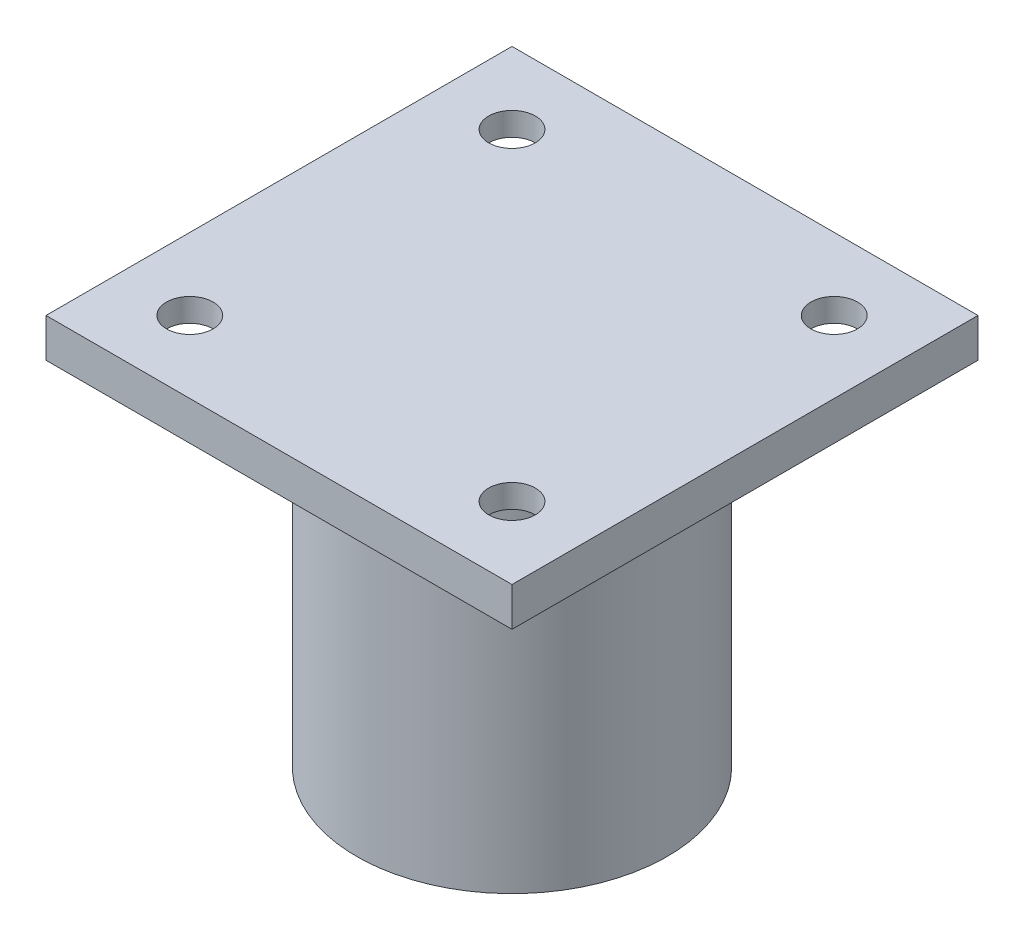
ISO-10303-21;
HEADER;
FILE_DESCRIPTION(('STEP AP214'),'2;1');
FILE_NAME('part.step','',(''),(''),'','','');
FILE_SCHEMA(('AUTOMOTIVE_DESIGN { 1 0 10303 214 1 1 1 1 }'));
ENDSEC;
DATA;
#1=APPLICATION_CONTEXT('core data for automotive mechanical design processes');
#2=APPLICATION_PROTOCOL_DEFINITION('international standard','automotive_design',2000,#1);
#3=PRODUCT_CONTEXT('',#1,'mechanical');
#4=PRODUCT('Part','Part','',(#3));
#5=PRODUCT_RELATED_PRODUCT_CATEGORY('part','',(#4));
#6=PRODUCT_DEFINITION_FORMATION('','',#4);
#7=PRODUCT_DEFINITION_CONTEXT('part definition',#1,'design');
#8=PRODUCT_DEFINITION('design','',#6,#7);
#9=PRODUCT_DEFINITION_SHAPE('','',#8);
#10=(LENGTH_UNIT() NAMED_UNIT(*) SI_UNIT(.MILLI.,.METRE.));
#11=(NAMED_UNIT(*) PLANE_ANGLE_UNIT() SI_UNIT($,.RADIAN.));
#12=(NAMED_UNIT(*) SI_UNIT($,.STERADIAN.) SOLID_ANGLE_UNIT());
#13=UNCERTAINTY_MEASURE_WITH_UNIT(LENGTH_MEASURE(1.E-05),#10,'distance_accuracy_value','');
#14=(GEOMETRIC_REPRESENTATION_CONTEXT(3) GLOBAL_UNCERTAINTY_ASSIGNED_CONTEXT((#13)) GLOBAL_UNIT_ASSIGNED_CONTEXT((#10,
#11,#12)) REPRESENTATION_CONTEXT('',''));
#15=CARTESIAN_POINT('',(0.,0.,0.));
#16=DIRECTION('',(0.,0.,1.));
#17=DIRECTION('',(1.,0.,0.));
#18=AXIS2_PLACEMENT_3D('',#15,#16,#17);
#19=CARTESIAN_POINT('',(15.556349186104,-34.,-15.5563491861041));
#20=DIRECTION('',(0.,1.,0.));
#21=DIRECTION('',(0.,0.,1.));
#22=AXIS2_PLACEMENT_3D('',#19,#20,#21);
#23=CYLINDRICAL_SURFACE('',#22,2.25);
#24=CARTESIAN_POINT('',(15.556349186104,3.75,-15.5563491861041));
#25=DIRECTION('',(0.,1.,0.));
#26=DIRECTION('',(0.,0.,1.));
#27=AXIS2_PLACEMENT_3D('',#24,#25,#26);
#28=CIRCLE('',#27,2.25);
#29=CARTESIAN_POINT('',(15.556349186104,3.75,-13.3063491861041));
#30=VERTEX_POINT('',#29);
#31=EDGE_CURVE('E111',#30,#30,#28,.T.);
#32=ORIENTED_EDGE('',*,*,#31,.T.);
#33=EDGE_LOOP('',(#32));
#34=FACE_BOUND('',#33,.T.);
#35=CARTESIAN_POINT('',(15.556349186104,1.5,-15.5563491861041));
#36=DIRECTION('',(0.,-1.,0.));
#37=DIRECTION('',(0.,0.,-1.));
#38=AXIS2_PLACEMENT_3D('',#35,#36,#37);
#39=CIRCLE('',#38,2.25);
#40=CARTESIAN_POINT('',(15.556349186104,1.5,-17.8063491861041));
#41=VERTEX_POINT('',#40);
#42=EDGE_CURVE('E118',#41,#41,#39,.F.);
#43=ORIENTED_EDGE('',*,*,#42,.F.);
#44=EDGE_LOOP('',(#43));
#45=FACE_BOUND('',#44,.T.);
#46=ADVANCED_FACE('F35',(#34,#45),#23,.F.);
#47=CARTESIAN_POINT('',(-15.556349186104,-34.,15.5563491861041));
#48=DIRECTION('',(0.,1.,0.));
#49=DIRECTION('',(0.,0.,1.));
#50=AXIS2_PLACEMENT_3D('',#47,#48,#49);
#51=CYLINDRICAL_SURFACE('',#50,2.25);
#52=CARTESIAN_POINT('',(-15.556349186104,3.75,15.5563491861041));
#53=DIRECTION('',(0.,1.,0.));
#54=DIRECTION('',(0.,0.,1.));
#55=AXIS2_PLACEMENT_3D('',#52,#53,#54);
#56=CIRCLE('',#55,2.25);
#57=CARTESIAN_POINT('',(-15.556349186104,3.75,17.8063491861041));
#58=VERTEX_POINT('',#57);
#59=EDGE_CURVE('E112',#58,#58,#56,.T.);
#60=ORIENTED_EDGE('',*,*,#59,.T.);
#61=EDGE_LOOP('',(#60));
#62=FACE_BOUND('',#61,.T.);
#63=CARTESIAN_POINT('',(-15.556349186104,1.5,15.5563491861041));
#64=DIRECTION('',(0.,-1.,0.));
#65=DIRECTION('',(0.,0.,-1.));
#66=AXIS2_PLACEMENT_3D('',#63,#64,#65);
#67=CIRCLE('',#66,2.25);
#68=CARTESIAN_POINT('',(-15.556349186104,1.5,13.3063491861041));
#69=VERTEX_POINT('',#68);
#70=EDGE_CURVE('E152',#69,#69,#67,.F.);
#71=ORIENTED_EDGE('',*,*,#70,.F.);
#72=EDGE_LOOP('',(#71));
#73=FACE_BOUND('',#72,.T.);
#74=ADVANCED_FACE('F163',(#62,#73),#51,.F.);
#75=CARTESIAN_POINT('',(22.5,3.75,-22.5));
#76=DIRECTION('',(-1.,0.,0.));
#77=DIRECTION('',(0.,0.,1.));
#78=AXIS2_PLACEMENT_3D('',#75,#76,#77);
#79=PLANE('',#78);
#80=DIRECTION('',(0.,0.,-1.));
#81=VECTOR('',#80,1.);
#82=CARTESIAN_POINT('',(22.5,0.,-22.5));
#83=LINE('',#82,#81);
#84=CARTESIAN_POINT('',(22.5,0.,22.5));
#85=VERTEX_POINT('',#84);
#86=CARTESIAN_POINT('',(22.5,0.,-22.5));
#87=VERTEX_POINT('',#86);
#88=EDGE_CURVE('E124',#85,#87,#83,.T.);
#89=ORIENTED_EDGE('',*,*,#88,.T.);
#90=DIRECTION('',(0.,-1.,0.));
#91=VECTOR('',#90,1.);
#92=CARTESIAN_POINT('',(22.5,3.75,-22.5));
#93=LINE('',#92,#91);
#94=CARTESIAN_POINT('',(22.5,3.75,-22.5));
#95=VERTEX_POINT('',#94);
#96=EDGE_CURVE('E11',#95,#87,#93,.T.);
#97=ORIENTED_EDGE('',*,*,#96,.F.);
#98=DIRECTION('',(0.,0.,-1.));
#99=VECTOR('',#98,1.);
#100=CARTESIAN_POINT('',(22.5,3.75,-22.5));
#101=LINE('',#100,#99);
#102=CARTESIAN_POINT('',(22.5,3.75,22.5));
#103=VERTEX_POINT('',#102);
#104=EDGE_CURVE('E125',#103,#95,#101,.T.);
#105=ORIENTED_EDGE('',*,*,#104,.F.);
#106=DIRECTION('',(0.,-1.,0.));
#107=VECTOR('',#106,1.);
#108=CARTESIAN_POINT('',(22.5,3.75,22.5));
#109=LINE('',#108,#107);
#110=EDGE_CURVE('E135',#103,#85,#109,.T.);
#111=ORIENTED_EDGE('',*,*,#110,.T.);
#112=EDGE_LOOP('',(#89,#97,#105,#111));
#113=FACE_BOUND('',#112,.T.);
#114=ADVANCED_FACE('F37',(#113),#79,.F.);
#115=CARTESIAN_POINT('',(-22.5,3.75,-22.5));
#116=DIRECTION('',(0.,0.,1.));
#117=DIRECTION('',(1.,0.,0.));
#118=AXIS2_PLACEMENT_3D('',#115,#116,#117);
#119=PLANE('',#118);
#120=DIRECTION('',(-1.,0.,0.));
#121=VECTOR('',#120,1.);
#122=CARTESIAN_POINT('',(-22.5,0.,-22.5));
#123=LINE('',#122,#121);
#124=CARTESIAN_POINT('',(-22.5,0.,-22.5));
#125=VERTEX_POINT('',#124);
#126=EDGE_CURVE('E138',#87,#125,#123,.T.);
#127=ORIENTED_EDGE('',*,*,#126,.T.);
#128=DIRECTION('',(0.,-1.,0.));
#129=VECTOR('',#128,1.);
#130=CARTESIAN_POINT('',(-22.5,3.75,-22.5));
#131=LINE('',#130,#129);
#132=CARTESIAN_POINT('',(-22.5,3.75,-22.5));
#133=VERTEX_POINT('',#132);
#134=EDGE_CURVE('E44',#133,#125,#131,.T.);
#135=ORIENTED_EDGE('',*,*,#134,.F.);
#136=DIRECTION('',(-1.,0.,0.));
#137=VECTOR('',#136,1.);
#138=CARTESIAN_POINT('',(-22.5,3.75,-22.5));
#139=LINE('',#138,#137);
#140=EDGE_CURVE('E128',#95,#133,#139,.T.);
#141=ORIENTED_EDGE('',*,*,#140,.F.);
#142=ORIENTED_EDGE('',*,*,#96,.T.);
#143=EDGE_LOOP('',(#127,#135,#141,#142));
#144=FACE_BOUND('',#143,.T.);
#145=ADVANCED_FACE('F196',(#144),#119,.F.);
#146=CARTESIAN_POINT('',(-22.5,3.75,-22.5));
#147=DIRECTION('',(1.,0.,0.));
#148=DIRECTION('',(0.,0.,-1.));
#149=AXIS2_PLACEMENT_3D('',#146,#147,#148);
#150=PLANE('',#149);
#151=DIRECTION('',(0.,0.,1.));
#152=VECTOR('',#151,1.);
#153=CARTESIAN_POINT('',(-22.5,0.,-22.5));
#154=LINE('',#153,#152);
#155=CARTESIAN_POINT('',(-22.5,0.,22.5));
#156=VERTEX_POINT('',#155);
#157=EDGE_CURVE('E140',#125,#156,#154,.T.);
#158=ORIENTED_EDGE('',*,*,#157,.T.);
#159=DIRECTION('',(0.,-1.,0.));
#160=VECTOR('',#159,1.);
#161=CARTESIAN_POINT('',(-22.5,3.75,22.5));
#162=LINE('',#161,#160);
#163=CARTESIAN_POINT('',(-22.5,3.75,22.5));
#164=VERTEX_POINT('',#163);
#165=EDGE_CURVE('E145',#164,#156,#162,.T.);
#166=ORIENTED_EDGE('',*,*,#165,.F.);
#167=DIRECTION('',(0.,0.,1.));
#168=VECTOR('',#167,1.);
#169=CARTESIAN_POINT('',(-22.5,3.75,-22.5));
#170=LINE('',#169,#168);
#171=EDGE_CURVE('E131',#133,#164,#170,.T.);
#172=ORIENTED_EDGE('',*,*,#171,.F.);
#173=ORIENTED_EDGE('',*,*,#134,.T.);
#174=EDGE_LOOP('',(#158,#166,#172,#173));
#175=FACE_BOUND('',#174,.T.);
#176=ADVANCED_FACE('F193',(#175),#150,.F.);
#177=CARTESIAN_POINT('',(-22.5,3.75,22.5));
#178=DIRECTION('',(0.,0.,-1.));
#179=DIRECTION('',(-1.,0.,0.));
#180=AXIS2_PLACEMENT_3D('',#177,#178,#179);
#181=PLANE('',#180);
#182=DIRECTION('',(1.,0.,0.));
#183=VECTOR('',#182,1.);
#184=CARTESIAN_POINT('',(-22.5,0.,22.5));
#185=LINE('',#184,#183);
#186=EDGE_CURVE('E129',#156,#85,#185,.T.);
#187=ORIENTED_EDGE('',*,*,#186,.T.);
#188=ORIENTED_EDGE('',*,*,#110,.F.);
#189=DIRECTION('',(1.,0.,0.));
#190=VECTOR('',#189,1.);
#191=CARTESIAN_POINT('',(-22.5,3.75,22.5));
#192=LINE('',#191,#190);
#193=EDGE_CURVE('E133',#164,#103,#192,.T.);
#194=ORIENTED_EDGE('',*,*,#193,.F.);
#195=ORIENTED_EDGE('',*,*,#165,.T.);
#196=EDGE_LOOP('',(#187,#188,#194,#195));
#197=FACE_BOUND('',#196,.T.);
#198=ADVANCED_FACE('F186',(#197),#181,.F.);
#199=CARTESIAN_POINT('',(0.,3.75,0.));
#200=DIRECTION('',(0.,1.,0.));
#201=DIRECTION('',(0.,0.,1.));
#202=AXIS2_PLACEMENT_3D('',#199,#200,#201);
#203=PLANE('',#202);
#204=CARTESIAN_POINT('',(-15.5563491861041,3.75,-15.556349186104));
#205=DIRECTION('',(0.,1.,0.));
#206=DIRECTION('',(0.,0.,1.));
#207=AXIS2_PLACEMENT_3D('',#204,#205,#206);
#208=CIRCLE('',#207,2.25);
#209=CARTESIAN_POINT('',(-15.5563491861041,3.75,-13.306349186104));
#210=VERTEX_POINT('',#209);
#211=EDGE_CURVE('E115',#210,#210,#208,.T.);
#212=ORIENTED_EDGE('',*,*,#211,.F.);
#213=EDGE_LOOP('',(#212));
#214=FACE_BOUND('',#213,.T.);
#215=ORIENTED_EDGE('',*,*,#59,.F.);
#216=EDGE_LOOP('',(#215));
#217=FACE_BOUND('',#216,.T.);
#218=CARTESIAN_POINT('',(15.5563491861041,3.75,15.556349186104));
#219=DIRECTION('',(0.,1.,0.));
#220=DIRECTION('',(0.,0.,1.));
#221=AXIS2_PLACEMENT_3D('',#218,#219,#220);
#222=CIRCLE('',#221,2.25);
#223=CARTESIAN_POINT('',(15.5563491861041,3.75,17.806349186104));
#224=VERTEX_POINT('',#223);
#225=EDGE_CURVE('E108',#224,#224,#222,.T.);
#226=ORIENTED_EDGE('',*,*,#225,.F.);
#227=EDGE_LOOP('',(#226));
#228=FACE_BOUND('',#227,.T.);
#229=ORIENTED_EDGE('',*,*,#31,.F.);
#230=EDGE_LOOP('',(#229));
#231=FACE_BOUND('',#230,.T.);
#232=ORIENTED_EDGE('',*,*,#104,.T.);
#233=ORIENTED_EDGE('',*,*,#140,.T.);
#234=ORIENTED_EDGE('',*,*,#171,.T.);
#235=ORIENTED_EDGE('',*,*,#193,.T.);
#236=EDGE_LOOP('',(#232,#233,#234,#235));
#237=FACE_BOUND('',#236,.T.);
#238=ADVANCED_FACE('F183',(#214,#217,#228,#231,#237),#203,.T.);
#239=CARTESIAN_POINT('',(0.,0.,0.));
#240=DIRECTION('',(0.,1.,0.));
#241=DIRECTION('',(0.,0.,1.));
#242=AXIS2_PLACEMENT_3D('',#239,#240,#241);
#243=PLANE('',#242);
#244=CARTESIAN_POINT('',(0.,0.,0.));
#245=DIRECTION('',(0.,-1.,0.));
#246=DIRECTION('',(0.,0.,-1.));
#247=AXIS2_PLACEMENT_3D('',#244,#245,#246);
#248=CIRCLE('',#247,17.);
#249=CARTESIAN_POINT('',(-12.0208152801712,0.,12.0208152801714));
#250=VERTEX_POINT('',#249);
#251=CARTESIAN_POINT('',(-12.0208152801712,0.,-12.0208152801714));
#252=VERTEX_POINT('',#251);
#253=EDGE_CURVE('E95',#250,#252,#248,.T.);
#254=ORIENTED_EDGE('',*,*,#253,.F.);
#255=CARTESIAN_POINT('',(-15.556349186104,0.,15.5563491861041));
#256=DIRECTION('',(0.,-1.,0.));
#257=DIRECTION('',(0.,0.,-1.));
#258=AXIS2_PLACEMENT_3D('',#255,#256,#257);
#259=CIRCLE('',#258,5.);
#260=EDGE_CURVE('E91',#250,#250,#259,.T.);
#261=ORIENTED_EDGE('',*,*,#260,.F.);
#262=CARTESIAN_POINT('',(12.0208152801712,0.,12.0208152801714));
#263=VERTEX_POINT('',#262);
#264=EDGE_CURVE('E59',#263,#250,#248,.T.);
#265=ORIENTED_EDGE('',*,*,#264,.F.);
#266=CARTESIAN_POINT('',(15.556349186104,0.,15.5563491861041));
#267=DIRECTION('',(0.,-1.,0.));
#268=DIRECTION('',(0.,0.,1.));
#269=AXIS2_PLACEMENT_3D('',#266,#267,#268);
#270=CIRCLE('',#269,5.);
#271=EDGE_CURVE('E104',#263,#263,#270,.T.);
#272=ORIENTED_EDGE('',*,*,#271,.F.);
#273=CARTESIAN_POINT('',(12.0208152801712,0.,-12.0208152801714));
#274=VERTEX_POINT('',#273);
#275=EDGE_CURVE('E448',#274,#263,#248,.T.);
#276=ORIENTED_EDGE('',*,*,#275,.F.);
#277=CARTESIAN_POINT('',(15.5563491861039,0.,-15.5563491861041));
#278=DIRECTION('',(0.,-1.,0.));
#279=DIRECTION('',(0.,0.,-1.));
#280=AXIS2_PLACEMENT_3D('',#277,#278,#279);
#281=CIRCLE('',#280,5.);
#282=EDGE_CURVE('E482',#274,#274,#281,.T.);
#283=ORIENTED_EDGE('',*,*,#282,.F.);
#284=EDGE_CURVE('E52',#252,#274,#248,.T.);
#285=ORIENTED_EDGE('',*,*,#284,.F.);
#286=CARTESIAN_POINT('',(-15.5563491861039,0.,-15.5563491861041));
#287=DIRECTION('',(0.,-1.,0.));
#288=DIRECTION('',(0.,0.,1.));
#289=AXIS2_PLACEMENT_3D('',#286,#287,#288);
#290=CIRCLE('',#289,5.);
#291=EDGE_CURVE('E457',#252,#252,#290,.T.);
#292=ORIENTED_EDGE('',*,*,#291,.F.);
#293=EDGE_LOOP('',(#254,#261,#265,#272,#276,#283,#285,#292));
#294=FACE_BOUND('',#293,.T.);
#295=ORIENTED_EDGE('',*,*,#88,.F.);
#296=ORIENTED_EDGE('',*,*,#186,.F.);
#297=ORIENTED_EDGE('',*,*,#157,.F.);
#298=ORIENTED_EDGE('',*,*,#126,.F.);
#299=EDGE_LOOP('',(#295,#296,#297,#298));
#300=FACE_BOUND('',#299,.T.);
#301=ADVANCED_FACE('F92',(#294,#300),#243,.F.);
#302=CARTESIAN_POINT('',(15.5563491861041,-34.,15.556349186104));
#303=DIRECTION('',(0.,1.,0.));
#304=DIRECTION('',(0.,0.,1.));
#305=AXIS2_PLACEMENT_3D('',#302,#303,#304);
#306=CYLINDRICAL_SURFACE('',#305,2.25);
#307=CARTESIAN_POINT('',(15.5563491861041,1.5,15.556349186104));
#308=DIRECTION('',(0.,1.,0.));
#309=DIRECTION('',(0.,0.,1.));
#310=AXIS2_PLACEMENT_3D('',#307,#308,#309);
#311=CIRCLE('',#310,2.25);
#312=CARTESIAN_POINT('',(15.5563491861041,1.5,17.806349186104));
#313=VERTEX_POINT('',#312);
#314=EDGE_CURVE('E155',#313,#313,#311,.F.);
#315=ORIENTED_EDGE('',*,*,#314,.T.);
#316=EDGE_LOOP('',(#315));
#317=FACE_BOUND('',#316,.T.);
#318=ORIENTED_EDGE('',*,*,#225,.T.);
#319=EDGE_LOOP('',(#318));
#320=FACE_BOUND('',#319,.T.);
#321=ADVANCED_FACE('F190',(#317,#320),#306,.F.);
#322=CARTESIAN_POINT('',(-15.5563491861041,-34.,-15.556349186104));
#323=DIRECTION('',(0.,1.,0.));
#324=DIRECTION('',(0.,0.,1.));
#325=AXIS2_PLACEMENT_3D('',#322,#323,#324);
#326=CYLINDRICAL_SURFACE('',#325,2.25);
#327=CARTESIAN_POINT('',(-15.5563491861041,1.5,-15.556349186104));
#328=DIRECTION('',(0.,1.,0.));
#329=DIRECTION('',(0.,0.,1.));
#330=AXIS2_PLACEMENT_3D('',#327,#328,#329);
#331=CIRCLE('',#330,2.25);
#332=CARTESIAN_POINT('',(-15.5563491861041,1.5,-13.306349186104));
#333=VERTEX_POINT('',#332);
#334=EDGE_CURVE('E101',#333,#333,#331,.F.);
#335=ORIENTED_EDGE('',*,*,#334,.T.);
#336=EDGE_LOOP('',(#335));
#337=FACE_BOUND('',#336,.T.);
#338=ORIENTED_EDGE('',*,*,#211,.T.);
#339=EDGE_LOOP('',(#338));
#340=FACE_BOUND('',#339,.T.);
#341=ADVANCED_FACE('F173',(#337,#340),#326,.F.);
#342=CARTESIAN_POINT('',(-15.5563491861039,1.5,-15.5563491861041));
#343=DIRECTION('',(0.,1.,0.));
#344=DIRECTION('',(0.,0.,1.));
#345=AXIS2_PLACEMENT_3D('',#342,#343,#344);
#346=PLANE('',#345);
#347=CARTESIAN_POINT('',(-15.5563491861039,1.5,-15.5563491861041));
#348=DIRECTION('',(0.,-1.,0.));
#349=DIRECTION('',(0.,0.,1.));
#350=AXIS2_PLACEMENT_3D('',#347,#348,#349);
#351=CIRCLE('',#350,5.);
#352=CARTESIAN_POINT('',(-15.5563491861039,1.5,-10.5563491861041));
#353=VERTEX_POINT('',#352);
#354=EDGE_CURVE('E485',#353,#353,#351,.T.);
#355=ORIENTED_EDGE('',*,*,#354,.T.);
#356=EDGE_LOOP('',(#355));
#357=FACE_BOUND('',#356,.T.);
#358=ORIENTED_EDGE('',*,*,#334,.F.);
#359=EDGE_LOOP('',(#358));
#360=FACE_BOUND('',#359,.T.);
#361=ADVANCED_FACE('F243',(#357,#360),#346,.F.);
#362=CARTESIAN_POINT('',(-15.5563491861039,1.5,-15.5563491861041));
#363=DIRECTION('',(0.,-1.,0.));
#364=DIRECTION('',(0.,0.,-1.));
#365=AXIS2_PLACEMENT_3D('',#362,#363,#364);
#366=CYLINDRICAL_SURFACE('',#365,5.);
#367=ORIENTED_EDGE('',*,*,#354,.F.);
#368=EDGE_LOOP('',(#367));
#369=FACE_BOUND('',#368,.T.);
#370=ORIENTED_EDGE('',*,*,#291,.T.);
#371=EDGE_LOOP('',(#370));
#372=FACE_BOUND('',#371,.T.);
#373=ADVANCED_FACE('F252',(#369,#372),#366,.F.);
#374=CARTESIAN_POINT('',(-15.556349186104,1.5,15.5563491861041));
#375=DIRECTION('',(0.,-1.,0.));
#376=DIRECTION('',(0.,0.,-1.));
#377=AXIS2_PLACEMENT_3D('',#374,#375,#376);
#378=PLANE('',#377);
#379=CARTESIAN_POINT('',(-15.556349186104,1.5,15.5563491861041));
#380=DIRECTION('',(0.,-1.,0.));
#381=DIRECTION('',(0.,0.,-1.));
#382=AXIS2_PLACEMENT_3D('',#379,#380,#381);
#383=CIRCLE('',#382,5.);
#384=CARTESIAN_POINT('',(-15.556349186104,1.5,10.5563491861041));
#385=VERTEX_POINT('',#384);
#386=EDGE_CURVE('E97',#385,#385,#383,.T.);
#387=ORIENTED_EDGE('',*,*,#386,.T.);
#388=EDGE_LOOP('',(#387));
#389=FACE_BOUND('',#388,.T.);
#390=ORIENTED_EDGE('',*,*,#70,.T.);
#391=EDGE_LOOP('',(#390));
#392=FACE_BOUND('',#391,.T.);
#393=ADVANCED_FACE('F260',(#389,#392),#378,.T.);
#394=CARTESIAN_POINT('',(-15.556349186104,1.5,15.5563491861041));
#395=DIRECTION('',(0.,-1.,0.));
#396=DIRECTION('',(0.,0.,-1.));
#397=AXIS2_PLACEMENT_3D('',#394,#395,#396);
#398=CYLINDRICAL_SURFACE('',#397,5.);
#399=ORIENTED_EDGE('',*,*,#386,.F.);
#400=EDGE_LOOP('',(#399));
#401=FACE_BOUND('',#400,.T.);
#402=ORIENTED_EDGE('',*,*,#260,.T.);
#403=EDGE_LOOP('',(#402));
#404=FACE_BOUND('',#403,.T.);
#405=ADVANCED_FACE('F265',(#401,#404),#398,.F.);
#406=CARTESIAN_POINT('',(15.556349186104,1.5,15.5563491861041));
#407=DIRECTION('',(0.,1.,0.));
#408=DIRECTION('',(0.,0.,1.));
#409=AXIS2_PLACEMENT_3D('',#406,#407,#408);
#410=PLANE('',#409);
#411=CARTESIAN_POINT('',(15.556349186104,1.5,15.5563491861041));
#412=DIRECTION('',(0.,-1.,0.));
#413=DIRECTION('',(0.,0.,1.));
#414=AXIS2_PLACEMENT_3D('',#411,#412,#413);
#415=CIRCLE('',#414,5.);
#416=CARTESIAN_POINT('',(15.556349186104,1.5,20.5563491861041));
#417=VERTEX_POINT('',#416);
#418=EDGE_CURVE('E98',#417,#417,#415,.T.);
#419=ORIENTED_EDGE('',*,*,#418,.T.);
#420=EDGE_LOOP('',(#419));
#421=FACE_BOUND('',#420,.T.);
#422=ORIENTED_EDGE('',*,*,#314,.F.);
#423=EDGE_LOOP('',(#422));
#424=FACE_BOUND('',#423,.T.);
#425=ADVANCED_FACE('F273',(#421,#424),#410,.F.);
#426=CARTESIAN_POINT('',(15.556349186104,1.5,15.5563491861041));
#427=DIRECTION('',(0.,-1.,0.));
#428=DIRECTION('',(0.,0.,-1.));
#429=AXIS2_PLACEMENT_3D('',#426,#427,#428);
#430=CYLINDRICAL_SURFACE('',#429,5.);
#431=ORIENTED_EDGE('',*,*,#418,.F.);
#432=EDGE_LOOP('',(#431));
#433=FACE_BOUND('',#432,.T.);
#434=ORIENTED_EDGE('',*,*,#271,.T.);
#435=EDGE_LOOP('',(#434));
#436=FACE_BOUND('',#435,.T.);
#437=ADVANCED_FACE('F278',(#433,#436),#430,.F.);
#438=CARTESIAN_POINT('',(15.5563491861039,1.5,-15.5563491861041));
#439=DIRECTION('',(0.,-1.,0.));
#440=DIRECTION('',(0.,0.,-1.));
#441=AXIS2_PLACEMENT_3D('',#438,#439,#440);
#442=PLANE('',#441);
#443=CARTESIAN_POINT('',(15.5563491861039,1.5,-15.5563491861041));
#444=DIRECTION('',(0.,-1.,0.));
#445=DIRECTION('',(0.,0.,-1.));
#446=AXIS2_PLACEMENT_3D('',#443,#444,#445);
#447=CIRCLE('',#446,5.);
#448=CARTESIAN_POINT('',(15.5563491861039,1.5,-20.5563491861041));
#449=VERTEX_POINT('',#448);
#450=EDGE_CURVE('E479',#449,#449,#447,.T.);
#451=ORIENTED_EDGE('',*,*,#450,.T.);
#452=EDGE_LOOP('',(#451));
#453=FACE_BOUND('',#452,.T.);
#454=ORIENTED_EDGE('',*,*,#42,.T.);
#455=EDGE_LOOP('',(#454));
#456=FACE_BOUND('',#455,.T.);
#457=ADVANCED_FACE('F160',(#453,#456),#442,.T.);
#458=CARTESIAN_POINT('',(15.5563491861039,1.5,-15.5563491861041));
#459=DIRECTION('',(0.,-1.,0.));
#460=DIRECTION('',(0.,0.,-1.));
#461=AXIS2_PLACEMENT_3D('',#458,#459,#460);
#462=CYLINDRICAL_SURFACE('',#461,5.);
#463=ORIENTED_EDGE('',*,*,#450,.F.);
#464=EDGE_LOOP('',(#463));
#465=FACE_BOUND('',#464,.T.);
#466=ORIENTED_EDGE('',*,*,#282,.T.);
#467=EDGE_LOOP('',(#466));
#468=FACE_BOUND('',#467,.T.);
#469=ADVANCED_FACE('F290',(#465,#468),#462,.F.);
#470=CARTESIAN_POINT('',(0.,-4.,0.));
#471=DIRECTION('',(0.,1.,0.));
#472=DIRECTION('',(0.,0.,1.));
#473=AXIS2_PLACEMENT_3D('',#470,#471,#472);
#474=CYLINDRICAL_SURFACE('',#473,17.);
#475=CARTESIAN_POINT('',(0.,-4.,0.));
#476=DIRECTION('',(0.,-1.,0.));
#477=DIRECTION('',(0.,0.,-1.));
#478=AXIS2_PLACEMENT_3D('',#475,#476,#477);
#479=CIRCLE('',#478,17.);
#480=CARTESIAN_POINT('',(0.,-4.,-17.));
#481=VERTEX_POINT('',#480);
#482=EDGE_CURVE('E447',#481,#481,#479,.T.);
#483=ORIENTED_EDGE('',*,*,#482,.F.);
#484=EDGE_LOOP('',(#483));
#485=FACE_BOUND('',#484,.T.);
#486=ORIENTED_EDGE('',*,*,#275,.T.);
#487=ORIENTED_EDGE('',*,*,#264,.T.);
#488=ORIENTED_EDGE('',*,*,#253,.T.);
#489=ORIENTED_EDGE('',*,*,#284,.T.);
#490=EDGE_LOOP('',(#486,#487,#488,#489));
#491=FACE_BOUND('',#490,.T.);
#492=ADVANCED_FACE('F416',(#485,#491),#474,.T.);
#493=CARTESIAN_POINT('',(0.,-4.,0.));
#494=DIRECTION('',(0.,-1.,0.));
#495=DIRECTION('',(0.,0.,-1.));
#496=AXIS2_PLACEMENT_3D('',#493,#494,#495);
#497=PLANE('',#496);
#498=CARTESIAN_POINT('',(0.,-4.,0.));
#499=DIRECTION('',(0.,-1.,0.));
#500=DIRECTION('',(0.,0.,-1.));
#501=AXIS2_PLACEMENT_3D('',#498,#499,#500);
#502=CIRCLE('',#501,15.);
#503=CARTESIAN_POINT('',(0.,-4.,-15.));
#504=VERTEX_POINT('',#503);
#505=EDGE_CURVE('E39',#504,#504,#502,.T.);
#506=ORIENTED_EDGE('',*,*,#505,.F.);
#507=EDGE_LOOP('',(#506));
#508=FACE_BOUND('',#507,.T.);
#509=ORIENTED_EDGE('',*,*,#482,.T.);
#510=EDGE_LOOP('',(#509));
#511=FACE_BOUND('',#510,.T.);
#512=ADVANCED_FACE('F325',(#508,#511),#497,.T.);
#513=CARTESIAN_POINT('',(0.,-19.,7.5));
#514=DIRECTION('',(0.,-1.,0.));
#515=DIRECTION('',(0.,0.,-1.));
#516=AXIS2_PLACEMENT_3D('',#513,#514,#515);
#517=PLANE('',#516);
#518=CARTESIAN_POINT('',(0.,-19.,7.5));
#519=DIRECTION('',(0.,-1.,0.));
#520=DIRECTION('',(0.,0.,-1.));
#521=AXIS2_PLACEMENT_3D('',#518,#519,#520);
#522=CIRCLE('',#521,1.55);
#523=CARTESIAN_POINT('',(0.,-19.,5.95));
#524=VERTEX_POINT('',#523);
#525=EDGE_CURVE('E473',#524,#524,#522,.T.);
#526=ORIENTED_EDGE('',*,*,#525,.T.);
#527=EDGE_LOOP('',(#526));
#528=FACE_BOUND('',#527,.T.);
#529=ADVANCED_FACE('F320',(#528),#517,.T.);
#530=CARTESIAN_POINT('',(-7.5,-19.,0.));
#531=DIRECTION('',(0.,-1.,0.));
#532=DIRECTION('',(0.,0.,-1.));
#533=AXIS2_PLACEMENT_3D('',#530,#531,#532);
#534=PLANE('',#533);
#535=CARTESIAN_POINT('',(-7.5,-19.,0.));
#536=DIRECTION('',(0.,-1.,0.));
#537=DIRECTION('',(0.,0.,-1.));
#538=AXIS2_PLACEMENT_3D('',#535,#536,#537);
#539=CIRCLE('',#538,1.55);
#540=CARTESIAN_POINT('',(-7.5,-19.,-1.55));
#541=VERTEX_POINT('',#540);
#542=EDGE_CURVE('E467',#541,#541,#539,.T.);
#543=ORIENTED_EDGE('',*,*,#542,.T.);
#544=EDGE_LOOP('',(#543));
#545=FACE_BOUND('',#544,.T.);
#546=ADVANCED_FACE('F324',(#545),#534,.T.);
#547=CARTESIAN_POINT('',(0.,-19.,-7.5));
#548=DIRECTION('',(0.,-1.,0.));
#549=DIRECTION('',(0.,0.,-1.));
#550=AXIS2_PLACEMENT_3D('',#547,#548,#549);
#551=PLANE('',#550);
#552=CARTESIAN_POINT('',(0.,-19.,-7.5));
#553=DIRECTION('',(0.,-1.,0.));
#554=DIRECTION('',(0.,0.,-1.));
#555=AXIS2_PLACEMENT_3D('',#552,#553,#554);
#556=CIRCLE('',#555,1.55);
#557=CARTESIAN_POINT('',(0.,-19.,-9.05));
#558=VERTEX_POINT('',#557);
#559=EDGE_CURVE('E461',#558,#558,#556,.T.);
#560=ORIENTED_EDGE('',*,*,#559,.T.);
#561=EDGE_LOOP('',(#560));
#562=FACE_BOUND('',#561,.T.);
#563=ADVANCED_FACE('F346',(#562),#551,.T.);
#564=CARTESIAN_POINT('',(7.5,-19.,0.));
#565=DIRECTION('',(0.,-1.,0.));
#566=DIRECTION('',(0.,0.,-1.));
#567=AXIS2_PLACEMENT_3D('',#564,#565,#566);
#568=PLANE('',#567);
#569=CARTESIAN_POINT('',(7.5,-19.,0.));
#570=DIRECTION('',(0.,-1.,0.));
#571=DIRECTION('',(0.,0.,-1.));
#572=AXIS2_PLACEMENT_3D('',#569,#570,#571);
#573=CIRCLE('',#572,1.55);
#574=CARTESIAN_POINT('',(7.5,-19.,-1.55));
#575=VERTEX_POINT('',#574);
#576=EDGE_CURVE('E454',#575,#575,#573,.T.);
#577=ORIENTED_EDGE('',*,*,#576,.T.);
#578=EDGE_LOOP('',(#577));
#579=FACE_BOUND('',#578,.T.);
#580=ADVANCED_FACE('F311',(#579),#568,.T.);
#581=CARTESIAN_POINT('',(0.,-19.,7.5));
#582=DIRECTION('',(0.,-1.,0.));
#583=DIRECTION('',(0.,0.,-1.));
#584=AXIS2_PLACEMENT_3D('',#581,#582,#583);
#585=CYLINDRICAL_SURFACE('',#584,1.55);
#586=ORIENTED_EDGE('',*,*,#525,.F.);
#587=EDGE_LOOP('',(#586));
#588=FACE_BOUND('',#587,.T.);
#589=CARTESIAN_POINT('',(0.,-34.,7.5));
#590=DIRECTION('',(0.,-1.,0.));
#591=DIRECTION('',(0.,0.,-1.));
#592=AXIS2_PLACEMENT_3D('',#589,#590,#591);
#593=CIRCLE('',#592,1.55);
#594=CARTESIAN_POINT('',(0.,-34.,5.95));
#595=VERTEX_POINT('',#594);
#596=EDGE_CURVE('E450',#595,#595,#593,.T.);
#597=ORIENTED_EDGE('',*,*,#596,.T.);
#598=EDGE_LOOP('',(#597));
#599=FACE_BOUND('',#598,.T.);
#600=ADVANCED_FACE('F305',(#588,#599),#585,.F.);
#601=CARTESIAN_POINT('',(-7.5,-19.,0.));
#602=DIRECTION('',(0.,-1.,0.));
#603=DIRECTION('',(0.,0.,-1.));
#604=AXIS2_PLACEMENT_3D('',#601,#602,#603);
#605=CYLINDRICAL_SURFACE('',#604,1.55);
#606=ORIENTED_EDGE('',*,*,#542,.F.);
#607=EDGE_LOOP('',(#606));
#608=FACE_BOUND('',#607,.T.);
#609=CARTESIAN_POINT('',(-7.5,-34.,0.));
#610=DIRECTION('',(0.,-1.,0.));
#611=DIRECTION('',(0.,0.,-1.));
#612=AXIS2_PLACEMENT_3D('',#609,#610,#611);
#613=CIRCLE('',#612,1.55);
#614=CARTESIAN_POINT('',(-7.5,-34.,-1.55));
#615=VERTEX_POINT('',#614);
#616=EDGE_CURVE('E470',#615,#615,#613,.T.);
#617=ORIENTED_EDGE('',*,*,#616,.T.);
#618=EDGE_LOOP('',(#617));
#619=FACE_BOUND('',#618,.T.);
#620=ADVANCED_FACE('F310',(#608,#619),#605,.F.);
#621=CARTESIAN_POINT('',(0.,-19.,-7.5));
#622=DIRECTION('',(0.,-1.,0.));
#623=DIRECTION('',(0.,0.,-1.));
#624=AXIS2_PLACEMENT_3D('',#621,#622,#623);
#625=CYLINDRICAL_SURFACE('',#624,1.55);
#626=ORIENTED_EDGE('',*,*,#559,.F.);
#627=EDGE_LOOP('',(#626));
#628=FACE_BOUND('',#627,.T.);
#629=CARTESIAN_POINT('',(0.,-34.,-7.5));
#630=DIRECTION('',(0.,-1.,0.));
#631=DIRECTION('',(0.,0.,-1.));
#632=AXIS2_PLACEMENT_3D('',#629,#630,#631);
#633=CIRCLE('',#632,1.55);
#634=CARTESIAN_POINT('',(0.,-34.,-9.05));
#635=VERTEX_POINT('',#634);
#636=EDGE_CURVE('E464',#635,#635,#633,.T.);
#637=ORIENTED_EDGE('',*,*,#636,.T.);
#638=EDGE_LOOP('',(#637));
#639=FACE_BOUND('',#638,.T.);
#640=ADVANCED_FACE('F336',(#628,#639),#625,.F.);
#641=CARTESIAN_POINT('',(7.5,-19.,0.));
#642=DIRECTION('',(0.,-1.,0.));
#643=DIRECTION('',(0.,0.,-1.));
#644=AXIS2_PLACEMENT_3D('',#641,#642,#643);
#645=CYLINDRICAL_SURFACE('',#644,1.55);
#646=ORIENTED_EDGE('',*,*,#576,.F.);
#647=EDGE_LOOP('',(#646));
#648=FACE_BOUND('',#647,.T.);
#649=CARTESIAN_POINT('',(7.5,-34.,0.));
#650=DIRECTION('',(0.,-1.,0.));
#651=DIRECTION('',(0.,0.,-1.));
#652=AXIS2_PLACEMENT_3D('',#649,#650,#651);
#653=CIRCLE('',#652,1.55);
#654=CARTESIAN_POINT('',(7.5,-34.,-1.55));
#655=VERTEX_POINT('',#654);
#656=EDGE_CURVE('E458',#655,#655,#653,.T.);
#657=ORIENTED_EDGE('',*,*,#656,.T.);
#658=EDGE_LOOP('',(#657));
#659=FACE_BOUND('',#658,.T.);
#660=ADVANCED_FACE('F178',(#648,#659),#645,.F.);
#661=CARTESIAN_POINT('',(0.,-34.,0.));
#662=DIRECTION('',(0.,-1.,0.));
#663=DIRECTION('',(0.,0.,-1.));
#664=AXIS2_PLACEMENT_3D('',#661,#662,#663);
#665=PLANE('',#664);
#666=ORIENTED_EDGE('',*,*,#656,.F.);
#667=EDGE_LOOP('',(#666));
#668=FACE_BOUND('',#667,.T.);
#669=ORIENTED_EDGE('',*,*,#636,.F.);
#670=EDGE_LOOP('',(#669));
#671=FACE_BOUND('',#670,.T.);
#672=ORIENTED_EDGE('',*,*,#616,.F.);
#673=EDGE_LOOP('',(#672));
#674=FACE_BOUND('',#673,.T.);
#675=ORIENTED_EDGE('',*,*,#596,.F.);
#676=EDGE_LOOP('',(#675));
#677=FACE_BOUND('',#676,.T.);
#678=CARTESIAN_POINT('',(0.,-34.,0.));
#679=DIRECTION('',(0.,-1.,0.));
#680=DIRECTION('',(0.,0.,-1.));
#681=AXIS2_PLACEMENT_3D('',#678,#679,#680);
#682=CIRCLE('',#681,15.);
#683=CARTESIAN_POINT('',(0.,-34.,-15.));
#684=VERTEX_POINT('',#683);
#685=EDGE_CURVE('E121',#684,#684,#682,.T.);
#686=ORIENTED_EDGE('',*,*,#685,.T.);
#687=EDGE_LOOP('',(#686));
#688=FACE_BOUND('',#687,.T.);
#689=ADVANCED_FACE('F174',(#668,#671,#674,#677,#688),#665,.T.);
#690=CARTESIAN_POINT('',(0.,-34.,0.));
#691=DIRECTION('',(0.,1.,0.));
#692=DIRECTION('',(0.,0.,1.));
#693=AXIS2_PLACEMENT_3D('',#690,#691,#692);
#694=CYLINDRICAL_SURFACE('',#693,15.);
#695=ORIENTED_EDGE('',*,*,#505,.T.);
#696=EDGE_LOOP('',(#695));
#697=FACE_BOUND('',#696,.T.);
#698=ORIENTED_EDGE('',*,*,#685,.F.);
#699=EDGE_LOOP('',(#698));
#700=FACE_BOUND('',#699,.T.);
#701=ADVANCED_FACE('F177',(#697,#700),#694,.T.);
#702=CLOSED_SHELL('',(#46,#74,#114,#145,#176,#198,#238,#301,#321,#341,#361,#373,#393,#405,#425,
#437,#457,#469,#492,#512,#529,#546,#563,#580,#600,#620,#640,#660,#689,#701));
#703=MANIFOLD_SOLID_BREP('B2',#702);
#704=ADVANCED_BREP_SHAPE_REPRESENTATION('',(#18,#703),#14);
#705=SHAPE_DEFINITION_REPRESENTATION(#9,#704);
ENDSEC;
END-ISO-10303-21;
